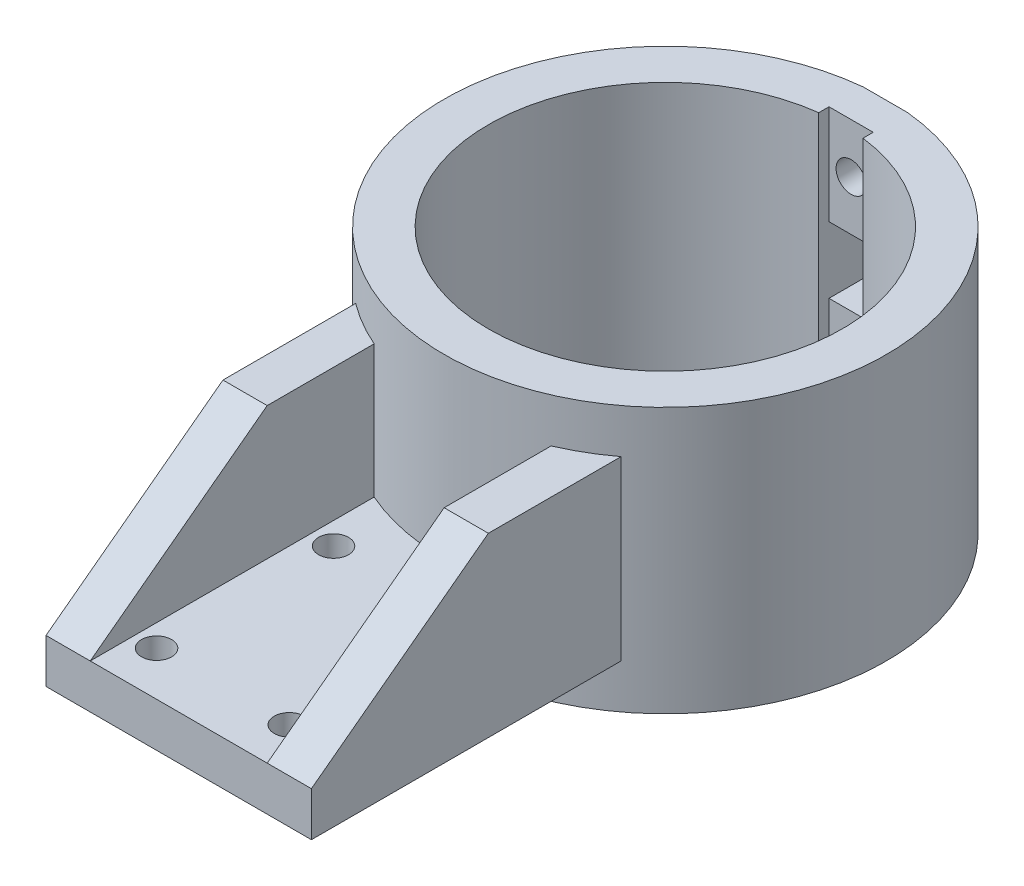
ISO-10303-21;
HEADER;
FILE_DESCRIPTION(('STEP AP214'),'2;1');
FILE_NAME('part.step','',(''),(''),'','','');
FILE_SCHEMA(('AUTOMOTIVE_DESIGN { 1 0 10303 214 1 1 1 1 }'));
ENDSEC;
DATA;
#1=APPLICATION_CONTEXT('core data for automotive mechanical design processes');
#2=APPLICATION_PROTOCOL_DEFINITION('international standard','automotive_design',2000,#1);
#3=PRODUCT_CONTEXT('',#1,'mechanical');
#4=PRODUCT('Part','Part','',(#3));
#5=PRODUCT_RELATED_PRODUCT_CATEGORY('part','',(#4));
#6=PRODUCT_DEFINITION_FORMATION('','',#4);
#7=PRODUCT_DEFINITION_CONTEXT('part definition',#1,'design');
#8=PRODUCT_DEFINITION('design','',#6,#7);
#9=PRODUCT_DEFINITION_SHAPE('','',#8);
#10=(LENGTH_UNIT() NAMED_UNIT(*) SI_UNIT(.MILLI.,.METRE.));
#11=(NAMED_UNIT(*) PLANE_ANGLE_UNIT() SI_UNIT($,.RADIAN.));
#12=(NAMED_UNIT(*) SI_UNIT($,.STERADIAN.) SOLID_ANGLE_UNIT());
#13=UNCERTAINTY_MEASURE_WITH_UNIT(LENGTH_MEASURE(1.E-05),#10,'distance_accuracy_value','');
#14=(GEOMETRIC_REPRESENTATION_CONTEXT(3) GLOBAL_UNCERTAINTY_ASSIGNED_CONTEXT((#13)) GLOBAL_UNIT_ASSIGNED_CONTEXT((#10,
#11,#12)) REPRESENTATION_CONTEXT('',''));
#15=CARTESIAN_POINT('',(0.,0.,0.));
#16=DIRECTION('',(0.,0.,1.));
#17=DIRECTION('',(1.,0.,0.));
#18=AXIS2_PLACEMENT_3D('',#15,#16,#17);
#19=CARTESIAN_POINT('',(-5.,0.,-42.));
#20=DIRECTION('',(0.,0.,-1.));
#21=DIRECTION('',(-1.,0.,0.));
#22=AXIS2_PLACEMENT_3D('',#19,#20,#21);
#23=PLANE('',#22);
#24=CARTESIAN_POINT('',(0.,11.25,-42.));
#25=DIRECTION('',(0.,0.,-1.));
#26=DIRECTION('',(-1.,0.,0.));
#27=AXIS2_PLACEMENT_3D('',#24,#25,#26);
#28=CIRCLE('',#27,3.39999999999999);
#29=CARTESIAN_POINT('',(-3.39999999999999,11.25,-42.));
#30=VERTEX_POINT('',#29);
#31=EDGE_CURVE('E325',#30,#30,#28,.T.);
#32=ORIENTED_EDGE('',*,*,#31,.T.);
#33=EDGE_LOOP('',(#32));
#34=FACE_BOUND('',#33,.T.);
#35=DIRECTION('',(0.,1.,0.));
#36=VECTOR('',#35,1.);
#37=CARTESIAN_POINT('',(5.,0.,-42.));
#38=LINE('',#37,#36);
#39=CARTESIAN_POINT('',(5.,0.,-42.));
#40=VERTEX_POINT('',#39);
#41=CARTESIAN_POINT('',(5.,22.5,-42.));
#42=VERTEX_POINT('',#41);
#43=EDGE_CURVE('E355',#40,#42,#38,.T.);
#44=ORIENTED_EDGE('',*,*,#43,.T.);
#45=DIRECTION('',(1.,0.,0.));
#46=VECTOR('',#45,1.);
#47=CARTESIAN_POINT('',(5.,22.5,-42.));
#48=LINE('',#47,#46);
#49=CARTESIAN_POINT('',(-5.,22.5,-42.));
#50=VERTEX_POINT('',#49);
#51=EDGE_CURVE('E54',#50,#42,#48,.T.);
#52=ORIENTED_EDGE('',*,*,#51,.F.);
#53=DIRECTION('',(0.,1.,0.));
#54=VECTOR('',#53,1.);
#55=CARTESIAN_POINT('',(-5.,0.,-42.));
#56=LINE('',#55,#54);
#57=CARTESIAN_POINT('',(-5.,0.,-42.));
#58=VERTEX_POINT('',#57);
#59=EDGE_CURVE('E215',#58,#50,#56,.T.);
#60=ORIENTED_EDGE('',*,*,#59,.F.);
#61=DIRECTION('',(-1.,0.,0.));
#62=VECTOR('',#61,1.);
#63=CARTESIAN_POINT('',(-5.,0.,-42.));
#64=LINE('',#63,#62);
#65=EDGE_CURVE('E341',#40,#58,#64,.T.);
#66=ORIENTED_EDGE('',*,*,#65,.F.);
#67=EDGE_LOOP('',(#44,#52,#60,#66));
#68=FACE_BOUND('',#67,.T.);
#69=ADVANCED_FACE('F37',(#34,#68),#23,.F.);
#70=CARTESIAN_POINT('',(5.,0.,-49.749371855331));
#71=DIRECTION('',(0.,0.,1.));
#72=DIRECTION('',(1.,0.,0.));
#73=AXIS2_PLACEMENT_3D('',#70,#71,#72);
#74=PLANE('',#73);
#75=CARTESIAN_POINT('',(0.,11.25,-49.749371855331));
#76=DIRECTION('',(0.,0.,-1.));
#77=DIRECTION('',(-1.,0.,0.));
#78=AXIS2_PLACEMENT_3D('',#75,#76,#77);
#79=CIRCLE('',#78,3.39999999999999);
#80=CARTESIAN_POINT('',(-3.4,11.25,-49.749371855331));
#81=VERTEX_POINT('',#80);
#82=EDGE_CURVE('E298',#81,#81,#79,.T.);
#83=ORIENTED_EDGE('',*,*,#82,.F.);
#84=EDGE_LOOP('',(#83));
#85=FACE_BOUND('',#84,.T.);
#86=DIRECTION('',(0.,1.,0.));
#87=VECTOR('',#86,1.);
#88=CARTESIAN_POINT('',(-5.,0.,-49.749371855331));
#89=LINE('',#88,#87);
#90=CARTESIAN_POINT('',(-5.,0.,-49.749371855331));
#91=VERTEX_POINT('',#90);
#92=CARTESIAN_POINT('',(-5.,22.5,-49.749371855331));
#93=VERTEX_POINT('',#92);
#94=EDGE_CURVE('E193',#91,#93,#89,.T.);
#95=ORIENTED_EDGE('',*,*,#94,.T.);
#96=DIRECTION('',(-1.,0.,0.));
#97=VECTOR('',#96,1.);
#98=CARTESIAN_POINT('',(5.,22.5,-49.749371855331));
#99=LINE('',#98,#97);
#100=CARTESIAN_POINT('',(5.,22.5,-49.749371855331));
#101=VERTEX_POINT('',#100);
#102=EDGE_CURVE('E171',#101,#93,#99,.T.);
#103=ORIENTED_EDGE('',*,*,#102,.F.);
#104=DIRECTION('',(0.,1.,0.));
#105=VECTOR('',#104,1.);
#106=CARTESIAN_POINT('',(5.,0.,-49.749371855331));
#107=LINE('',#106,#105);
#108=CARTESIAN_POINT('',(5.,0.,-49.749371855331));
#109=VERTEX_POINT('',#108);
#110=EDGE_CURVE('E190',#109,#101,#107,.T.);
#111=ORIENTED_EDGE('',*,*,#110,.F.);
#112=DIRECTION('',(1.,0.,0.));
#113=VECTOR('',#112,1.);
#114=CARTESIAN_POINT('',(5.,0.,-49.749371855331));
#115=LINE('',#114,#113);
#116=EDGE_CURVE('E356',#91,#109,#115,.T.);
#117=ORIENTED_EDGE('',*,*,#116,.F.);
#118=EDGE_LOOP('',(#95,#103,#111,#117));
#119=FACE_BOUND('',#118,.T.);
#120=ADVANCED_FACE('F189',(#85,#119),#74,.F.);
#121=CARTESIAN_POINT('',(0.,60.,0.));
#122=DIRECTION('',(0.,1.,0.));
#123=DIRECTION('',(0.,0.,1.));
#124=AXIS2_PLACEMENT_3D('',#121,#122,#123);
#125=PLANE('',#124);
#126=DIRECTION('',(0.,0.,-1.));
#127=VECTOR('',#126,1.);
#128=CARTESIAN_POINT('',(5.,60.,-42.));
#129=LINE('',#128,#127);
#130=CARTESIAN_POINT('',(5.,60.,-39.6862696659689));
#131=VERTEX_POINT('',#130);
#132=CARTESIAN_POINT('',(5.,60.,-42.));
#133=VERTEX_POINT('',#132);
#134=EDGE_CURVE('E200',#131,#133,#129,.T.);
#135=ORIENTED_EDGE('',*,*,#134,.F.);
#136=CARTESIAN_POINT('',(0.,60.,0.));
#137=DIRECTION('',(0.,1.,0.));
#138=DIRECTION('',(0.,0.,1.));
#139=AXIS2_PLACEMENT_3D('',#136,#137,#138);
#140=CIRCLE('',#139,40.);
#141=CARTESIAN_POINT('',(-5.,60.,-39.6862696659689));
#142=VERTEX_POINT('',#141);
#143=EDGE_CURVE('E282',#142,#131,#140,.T.);
#144=ORIENTED_EDGE('',*,*,#143,.F.);
#145=DIRECTION('',(0.,0.,1.));
#146=VECTOR('',#145,1.);
#147=CARTESIAN_POINT('',(-5.,60.,-42.));
#148=LINE('',#147,#146);
#149=CARTESIAN_POINT('',(-5.,60.,-42.));
#150=VERTEX_POINT('',#149);
#151=EDGE_CURVE('E342',#150,#142,#148,.T.);
#152=ORIENTED_EDGE('',*,*,#151,.F.);
#153=DIRECTION('',(-1.,0.,0.));
#154=VECTOR('',#153,1.);
#155=CARTESIAN_POINT('',(-5.,60.,-42.));
#156=LINE('',#155,#154);
#157=EDGE_CURVE('E204',#133,#150,#156,.T.);
#158=ORIENTED_EDGE('',*,*,#157,.F.);
#159=EDGE_LOOP('',(#135,#144,#152,#158));
#160=FACE_BOUND('',#159,.T.);
#161=DIRECTION('',(1.,0.,0.));
#162=VECTOR('',#161,1.);
#163=CARTESIAN_POINT('',(5.,60.,-49.749371855331));
#164=LINE('',#163,#162);
#165=CARTESIAN_POINT('',(-5.,60.,-49.749371855331));
#166=VERTEX_POINT('',#165);
#167=CARTESIAN_POINT('',(5.,60.,-49.749371855331));
#168=VERTEX_POINT('',#167);
#169=EDGE_CURVE('E208',#166,#168,#164,.T.);
#170=ORIENTED_EDGE('',*,*,#169,.F.);
#171=CARTESIAN_POINT('',(0.,60.,0.));
#172=DIRECTION('',(0.,1.,0.));
#173=DIRECTION('',(0.,0.,1.));
#174=AXIS2_PLACEMENT_3D('',#171,#172,#173);
#175=CIRCLE('',#174,50.);
#176=EDGE_CURVE('E287',#166,#168,#175,.T.);
#177=ORIENTED_EDGE('',*,*,#176,.T.);
#178=EDGE_LOOP('',(#170,#177));
#179=FACE_BOUND('',#178,.T.);
#180=ADVANCED_FACE('F364',(#160,#179),#125,.T.);
#181=CARTESIAN_POINT('',(0.,0.,0.));
#182=DIRECTION('',(0.,1.,0.));
#183=DIRECTION('',(0.,0.,1.));
#184=AXIS2_PLACEMENT_3D('',#181,#182,#183);
#185=PLANE('',#184);
#186=CARTESIAN_POINT('',(0.,0.,0.));
#187=DIRECTION('',(0.,1.,0.));
#188=DIRECTION('',(0.,0.,1.));
#189=AXIS2_PLACEMENT_3D('',#186,#187,#188);
#190=CIRCLE('',#189,40.);
#191=CARTESIAN_POINT('',(-5.,0.,-39.6862696659689));
#192=VERTEX_POINT('',#191);
#193=CARTESIAN_POINT('',(5.,0.,-39.6862696659689));
#194=VERTEX_POINT('',#193);
#195=EDGE_CURVE('E268',#192,#194,#190,.T.);
#196=ORIENTED_EDGE('',*,*,#195,.T.);
#197=DIRECTION('',(0.,0.,-1.));
#198=VECTOR('',#197,1.);
#199=CARTESIAN_POINT('',(5.,0.,-42.));
#200=LINE('',#199,#198);
#201=EDGE_CURVE('E338',#194,#40,#200,.T.);
#202=ORIENTED_EDGE('',*,*,#201,.T.);
#203=ORIENTED_EDGE('',*,*,#65,.T.);
#204=DIRECTION('',(0.,0.,1.));
#205=VECTOR('',#204,1.);
#206=CARTESIAN_POINT('',(-5.,0.,-42.));
#207=LINE('',#206,#205);
#208=EDGE_CURVE('E345',#58,#192,#207,.T.);
#209=ORIENTED_EDGE('',*,*,#208,.T.);
#210=EDGE_LOOP('',(#196,#202,#203,#209));
#211=FACE_BOUND('',#210,.T.);
#212=CARTESIAN_POINT('',(0.,0.,0.));
#213=DIRECTION('',(0.,1.,0.));
#214=DIRECTION('',(0.,0.,1.));
#215=AXIS2_PLACEMENT_3D('',#212,#213,#214);
#216=CIRCLE('',#215,50.);
#217=EDGE_CURVE('E199',#91,#109,#216,.T.);
#218=ORIENTED_EDGE('',*,*,#217,.F.);
#219=ORIENTED_EDGE('',*,*,#116,.T.);
#220=EDGE_LOOP('',(#218,#219));
#221=FACE_BOUND('',#220,.T.);
#222=ADVANCED_FACE('F378',(#211,#221),#185,.F.);
#223=CARTESIAN_POINT('',(0.,60.,0.));
#224=DIRECTION('',(0.,-1.,0.));
#225=DIRECTION('',(0.,0.,-1.));
#226=AXIS2_PLACEMENT_3D('',#223,#224,#225);
#227=CYLINDRICAL_SURFACE('',#226,50.);
#228=DIRECTION('',(0.,-1.,0.));
#229=VECTOR('',#228,1.);
#230=CARTESIAN_POINT('',(-20.,60.,45.8257569495584));
#231=LINE('',#230,#229);
#232=CARTESIAN_POINT('',(-20.,20.,45.8257569495584));
#233=VERTEX_POINT('',#232);
#234=CARTESIAN_POINT('',(-20.,50.,45.8257569495584));
#235=VERTEX_POINT('',#234);
#236=EDGE_CURVE('E236',#233,#235,#231,.F.);
#237=ORIENTED_EDGE('',*,*,#236,.F.);
#238=CARTESIAN_POINT('',(0.,20.,0.));
#239=DIRECTION('',(0.,1.,0.));
#240=DIRECTION('',(0.,0.,1.));
#241=AXIS2_PLACEMENT_3D('',#238,#239,#240);
#242=CIRCLE('',#241,50.);
#243=CARTESIAN_POINT('',(20.,20.,45.8257569495584));
#244=VERTEX_POINT('',#243);
#245=EDGE_CURVE('E264',#244,#233,#242,.F.);
#246=ORIENTED_EDGE('',*,*,#245,.F.);
#247=DIRECTION('',(0.,-1.,0.));
#248=VECTOR('',#247,1.);
#249=CARTESIAN_POINT('',(20.,60.,45.8257569495584));
#250=LINE('',#249,#248);
#251=CARTESIAN_POINT('',(20.,50.,45.8257569495584));
#252=VERTEX_POINT('',#251);
#253=EDGE_CURVE('E261',#252,#244,#250,.T.);
#254=ORIENTED_EDGE('',*,*,#253,.F.);
#255=CARTESIAN_POINT('',(0.,50.,0.));
#256=DIRECTION('',(0.,1.,0.));
#257=DIRECTION('',(-1.,0.,0.));
#258=AXIS2_PLACEMENT_3D('',#255,#256,#257);
#259=CIRCLE('',#258,50.);
#260=CARTESIAN_POINT('',(30.,50.,40.));
#261=VERTEX_POINT('',#260);
#262=EDGE_CURVE('E260',#261,#252,#259,.F.);
#263=ORIENTED_EDGE('',*,*,#262,.F.);
#264=DIRECTION('',(0.,-1.,0.));
#265=VECTOR('',#264,1.);
#266=CARTESIAN_POINT('',(30.,60.,40.));
#267=LINE('',#266,#265);
#268=CARTESIAN_POINT('',(30.,10.,40.));
#269=VERTEX_POINT('',#268);
#270=EDGE_CURVE('E257',#269,#261,#267,.F.);
#271=ORIENTED_EDGE('',*,*,#270,.F.);
#272=CARTESIAN_POINT('',(0.,10.,0.));
#273=DIRECTION('',(0.,-1.,0.));
#274=DIRECTION('',(1.,0.,0.));
#275=AXIS2_PLACEMENT_3D('',#272,#273,#274);
#276=CIRCLE('',#275,50.);
#277=CARTESIAN_POINT('',(-30.,10.,40.));
#278=VERTEX_POINT('',#277);
#279=EDGE_CURVE('E254',#278,#269,#276,.F.);
#280=ORIENTED_EDGE('',*,*,#279,.F.);
#281=DIRECTION('',(0.,-1.,0.));
#282=VECTOR('',#281,1.);
#283=CARTESIAN_POINT('',(-30.,60.,40.));
#284=LINE('',#283,#282);
#285=CARTESIAN_POINT('',(-30.,50.,40.));
#286=VERTEX_POINT('',#285);
#287=EDGE_CURVE('E235',#286,#278,#284,.T.);
#288=ORIENTED_EDGE('',*,*,#287,.F.);
#289=CARTESIAN_POINT('',(0.,50.,0.));
#290=DIRECTION('',(0.,1.,0.));
#291=DIRECTION('',(0.,0.,1.));
#292=AXIS2_PLACEMENT_3D('',#289,#290,#291);
#293=CIRCLE('',#292,50.);
#294=EDGE_CURVE('E244',#235,#286,#293,.F.);
#295=ORIENTED_EDGE('',*,*,#294,.F.);
#296=EDGE_LOOP('',(#237,#246,#254,#263,#271,#280,#288,#295));
#297=FACE_BOUND('',#296,.T.);
#298=ORIENTED_EDGE('',*,*,#176,.F.);
#299=CARTESIAN_POINT('',(-5.,37.5,-49.749371855331));
#300=VERTEX_POINT('',#299);
#301=EDGE_CURVE('E211',#300,#166,#89,.T.);
#302=ORIENTED_EDGE('',*,*,#301,.F.);
#303=DIRECTION('',(0.,1.,0.));
#304=VECTOR('',#303,1.);
#305=CARTESIAN_POINT('',(-5.,37.5,-49.749371855331));
#306=LINE('',#305,#304);
#307=EDGE_CURVE('E194',#93,#300,#306,.T.);
#308=ORIENTED_EDGE('',*,*,#307,.F.);
#309=ORIENTED_EDGE('',*,*,#94,.F.);
#310=ORIENTED_EDGE('',*,*,#217,.T.);
#311=ORIENTED_EDGE('',*,*,#110,.T.);
#312=DIRECTION('',(0.,-1.,0.));
#313=VECTOR('',#312,1.);
#314=CARTESIAN_POINT('',(5.,37.5,-49.749371855331));
#315=LINE('',#314,#313);
#316=CARTESIAN_POINT('',(5.,37.5,-49.749371855331));
#317=VERTEX_POINT('',#316);
#318=EDGE_CURVE('E178',#317,#101,#315,.T.);
#319=ORIENTED_EDGE('',*,*,#318,.F.);
#320=EDGE_CURVE('E201',#317,#168,#107,.T.);
#321=ORIENTED_EDGE('',*,*,#320,.T.);
#322=EDGE_LOOP('',(#298,#302,#308,#309,#310,#311,#319,#321));
#323=FACE_BOUND('',#322,.T.);
#324=ADVANCED_FACE('F39',(#297,#323),#227,.T.);
#325=CARTESIAN_POINT('',(0.,60.,0.));
#326=DIRECTION('',(0.,-1.,0.));
#327=DIRECTION('',(0.,0.,-1.));
#328=AXIS2_PLACEMENT_3D('',#325,#326,#327);
#329=CYLINDRICAL_SURFACE('',#328,40.);
#330=DIRECTION('',(0.,-1.,0.));
#331=VECTOR('',#330,1.);
#332=CARTESIAN_POINT('',(5.,60.,-39.6862696659689));
#333=LINE('',#332,#331);
#334=EDGE_CURVE('E11',#194,#131,#333,.F.);
#335=ORIENTED_EDGE('',*,*,#334,.F.);
#336=ORIENTED_EDGE('',*,*,#195,.F.);
#337=DIRECTION('',(0.,-1.,0.));
#338=VECTOR('',#337,1.);
#339=CARTESIAN_POINT('',(-5.,60.,-39.6862696659689));
#340=LINE('',#339,#338);
#341=EDGE_CURVE('E46',#142,#192,#340,.T.);
#342=ORIENTED_EDGE('',*,*,#341,.F.);
#343=ORIENTED_EDGE('',*,*,#143,.T.);
#344=EDGE_LOOP('',(#335,#336,#342,#343));
#345=FACE_BOUND('',#344,.T.);
#346=ADVANCED_FACE('F375',(#345),#329,.F.);
#347=CARTESIAN_POINT('',(-20.,20.,-50.002));
#348=DIRECTION('',(0.,1.,0.));
#349=DIRECTION('',(0.,0.,1.));
#350=AXIS2_PLACEMENT_3D('',#347,#348,#349);
#351=PLANE('',#350);
#352=CARTESIAN_POINT('',(-15.,20.,60.));
#353=DIRECTION('',(0.,1.,0.));
#354=DIRECTION('',(0.,0.,1.));
#355=AXIS2_PLACEMENT_3D('',#352,#353,#354);
#356=CIRCLE('',#355,3.39999999999999);
#357=CARTESIAN_POINT('',(-15.,20.,63.4));
#358=VERTEX_POINT('',#357);
#359=EDGE_CURVE('E444',#358,#358,#356,.T.);
#360=ORIENTED_EDGE('',*,*,#359,.F.);
#361=EDGE_LOOP('',(#360));
#362=FACE_BOUND('',#361,.T.);
#363=CARTESIAN_POINT('',(15.,20.,60.));
#364=DIRECTION('',(0.,1.,0.));
#365=DIRECTION('',(0.,0.,1.));
#366=AXIS2_PLACEMENT_3D('',#363,#364,#365);
#367=CIRCLE('',#366,3.39999999999999);
#368=CARTESIAN_POINT('',(15.,20.,63.4));
#369=VERTEX_POINT('',#368);
#370=EDGE_CURVE('E315',#369,#369,#367,.T.);
#371=ORIENTED_EDGE('',*,*,#370,.F.);
#372=EDGE_LOOP('',(#371));
#373=FACE_BOUND('',#372,.T.);
#374=CARTESIAN_POINT('',(-15.,20.,100.));
#375=DIRECTION('',(0.,1.,0.));
#376=DIRECTION('',(0.,0.,1.));
#377=AXIS2_PLACEMENT_3D('',#374,#375,#376);
#378=CIRCLE('',#377,3.39999999999999);
#379=CARTESIAN_POINT('',(-15.,20.,103.4));
#380=VERTEX_POINT('',#379);
#381=EDGE_CURVE('E303',#380,#380,#378,.T.);
#382=ORIENTED_EDGE('',*,*,#381,.F.);
#383=EDGE_LOOP('',(#382));
#384=FACE_BOUND('',#383,.T.);
#385=CARTESIAN_POINT('',(15.,20.,100.));
#386=DIRECTION('',(0.,1.,0.));
#387=DIRECTION('',(0.,0.,1.));
#388=AXIS2_PLACEMENT_3D('',#385,#386,#387);
#389=CIRCLE('',#388,3.39999999999999);
#390=CARTESIAN_POINT('',(15.,20.,103.4));
#391=VERTEX_POINT('',#390);
#392=EDGE_CURVE('E302',#391,#391,#389,.T.);
#393=ORIENTED_EDGE('',*,*,#392,.F.);
#394=EDGE_LOOP('',(#393));
#395=FACE_BOUND('',#394,.T.);
#396=DIRECTION('',(0.,0.,1.));
#397=VECTOR('',#396,1.);
#398=CARTESIAN_POINT('',(20.,20.,-50.002));
#399=LINE('',#398,#397);
#400=CARTESIAN_POINT('',(20.,20.,110.));
#401=VERTEX_POINT('',#400);
#402=EDGE_CURVE('E265',#244,#401,#399,.T.);
#403=ORIENTED_EDGE('',*,*,#402,.F.);
#404=ORIENTED_EDGE('',*,*,#245,.T.);
#405=DIRECTION('',(0.,0.,1.));
#406=VECTOR('',#405,1.);
#407=CARTESIAN_POINT('',(-20.,20.,-50.002));
#408=LINE('',#407,#406);
#409=CARTESIAN_POINT('',(-20.,20.,110.));
#410=VERTEX_POINT('',#409);
#411=EDGE_CURVE('E251',#233,#410,#408,.T.);
#412=ORIENTED_EDGE('',*,*,#411,.T.);
#413=DIRECTION('',(-1.,0.,0.));
#414=VECTOR('',#413,1.);
#415=CARTESIAN_POINT('',(20.,20.,110.));
#416=LINE('',#415,#414);
#417=EDGE_CURVE('E224',#401,#410,#416,.T.);
#418=ORIENTED_EDGE('',*,*,#417,.F.);
#419=EDGE_LOOP('',(#403,#404,#412,#418));
#420=FACE_BOUND('',#419,.T.);
#421=ADVANCED_FACE('F451',(#362,#373,#384,#395,#420),#351,.T.);
#422=CARTESIAN_POINT('',(20.,20.,-50.002));
#423=DIRECTION('',(-1.,0.,0.));
#424=DIRECTION('',(0.,0.,1.));
#425=AXIS2_PLACEMENT_3D('',#422,#423,#424);
#426=PLANE('',#425);
#427=DIRECTION('',(0.,-0.6,0.8));
#428=VECTOR('',#427,1.);
#429=CARTESIAN_POINT('',(20.,96.80096,7.59872000000002));
#430=LINE('',#429,#428);
#431=CARTESIAN_POINT('',(20.,50.,70.));
#432=VERTEX_POINT('',#431);
#433=EDGE_CURVE('E222',#432,#401,#430,.T.);
#434=ORIENTED_EDGE('',*,*,#433,.F.);
#435=DIRECTION('',(0.,0.,1.));
#436=VECTOR('',#435,1.);
#437=CARTESIAN_POINT('',(20.,50.,-50.002));
#438=LINE('',#437,#436);
#439=EDGE_CURVE('E269',#252,#432,#438,.T.);
#440=ORIENTED_EDGE('',*,*,#439,.F.);
#441=ORIENTED_EDGE('',*,*,#253,.T.);
#442=ORIENTED_EDGE('',*,*,#402,.T.);
#443=EDGE_LOOP('',(#434,#440,#441,#442));
#444=FACE_BOUND('',#443,.T.);
#445=ADVANCED_FACE('F454',(#444),#426,.T.);
#446=CARTESIAN_POINT('',(20.,50.,-50.002));
#447=DIRECTION('',(0.,1.,0.));
#448=DIRECTION('',(-1.,0.,0.));
#449=AXIS2_PLACEMENT_3D('',#446,#447,#448);
#450=PLANE('',#449);
#451=DIRECTION('',(-1.,0.,0.));
#452=VECTOR('',#451,1.);
#453=CARTESIAN_POINT('',(50.,50.,70.));
#454=LINE('',#453,#452);
#455=CARTESIAN_POINT('',(30.,50.,70.));
#456=VERTEX_POINT('',#455);
#457=EDGE_CURVE('E214',#456,#432,#454,.T.);
#458=ORIENTED_EDGE('',*,*,#457,.F.);
#459=DIRECTION('',(0.,0.,1.));
#460=VECTOR('',#459,1.);
#461=CARTESIAN_POINT('',(30.,50.,-50.002));
#462=LINE('',#461,#460);
#463=EDGE_CURVE('E272',#261,#456,#462,.T.);
#464=ORIENTED_EDGE('',*,*,#463,.F.);
#465=ORIENTED_EDGE('',*,*,#262,.T.);
#466=ORIENTED_EDGE('',*,*,#439,.T.);
#467=EDGE_LOOP('',(#458,#464,#465,#466));
#468=FACE_BOUND('',#467,.T.);
#469=ADVANCED_FACE('F470',(#468),#450,.T.);
#470=CARTESIAN_POINT('',(30.,10.,-50.002));
#471=DIRECTION('',(1.,0.,0.));
#472=DIRECTION('',(0.,0.,-1.));
#473=AXIS2_PLACEMENT_3D('',#470,#471,#472);
#474=PLANE('',#473);
#475=DIRECTION('',(0.,0.6,-0.8));
#476=VECTOR('',#475,1.);
#477=CARTESIAN_POINT('',(30.,93.20096,12.39872));
#478=LINE('',#477,#476);
#479=CARTESIAN_POINT('',(30.,20.,110.));
#480=VERTEX_POINT('',#479);
#481=EDGE_CURVE('E220',#480,#456,#478,.T.);
#482=ORIENTED_EDGE('',*,*,#481,.F.);
#483=DIRECTION('',(0.,1.,0.));
#484=VECTOR('',#483,1.);
#485=CARTESIAN_POINT('',(30.,10.,110.));
#486=LINE('',#485,#484);
#487=CARTESIAN_POINT('',(30.,10.,110.));
#488=VERTEX_POINT('',#487);
#489=EDGE_CURVE('E232',#488,#480,#486,.T.);
#490=ORIENTED_EDGE('',*,*,#489,.F.);
#491=DIRECTION('',(0.,0.,1.));
#492=VECTOR('',#491,1.);
#493=CARTESIAN_POINT('',(30.,10.,-50.002));
#494=LINE('',#493,#492);
#495=EDGE_CURVE('E275',#269,#488,#494,.T.);
#496=ORIENTED_EDGE('',*,*,#495,.F.);
#497=ORIENTED_EDGE('',*,*,#270,.T.);
#498=ORIENTED_EDGE('',*,*,#463,.T.);
#499=EDGE_LOOP('',(#482,#490,#496,#497,#498));
#500=FACE_BOUND('',#499,.T.);
#501=ADVANCED_FACE('F473',(#500),#474,.T.);
#502=CARTESIAN_POINT('',(30.,10.,-50.002));
#503=DIRECTION('',(0.,-1.,0.));
#504=DIRECTION('',(1.,0.,0.));
#505=AXIS2_PLACEMENT_3D('',#502,#503,#504);
#506=PLANE('',#505);
#507=CARTESIAN_POINT('',(-15.,10.,60.));
#508=DIRECTION('',(0.,-1.,0.));
#509=DIRECTION('',(1.,0.,0.));
#510=AXIS2_PLACEMENT_3D('',#507,#508,#509);
#511=CIRCLE('',#510,3.39999999999999);
#512=CARTESIAN_POINT('',(-11.6,10.,60.));
#513=VERTEX_POINT('',#512);
#514=EDGE_CURVE('E41',#513,#513,#511,.T.);
#515=ORIENTED_EDGE('',*,*,#514,.F.);
#516=EDGE_LOOP('',(#515));
#517=FACE_BOUND('',#516,.T.);
#518=CARTESIAN_POINT('',(15.,10.,60.));
#519=DIRECTION('',(0.,-1.,0.));
#520=DIRECTION('',(1.,0.,0.));
#521=AXIS2_PLACEMENT_3D('',#518,#519,#520);
#522=CIRCLE('',#521,3.39999999999999);
#523=CARTESIAN_POINT('',(18.4,10.,60.));
#524=VERTEX_POINT('',#523);
#525=EDGE_CURVE('E310',#524,#524,#522,.T.);
#526=ORIENTED_EDGE('',*,*,#525,.F.);
#527=EDGE_LOOP('',(#526));
#528=FACE_BOUND('',#527,.T.);
#529=CARTESIAN_POINT('',(-15.,10.,100.));
#530=DIRECTION('',(0.,-1.,0.));
#531=DIRECTION('',(1.,0.,0.));
#532=AXIS2_PLACEMENT_3D('',#529,#530,#531);
#533=CIRCLE('',#532,3.39999999999999);
#534=CARTESIAN_POINT('',(-11.6,10.,100.));
#535=VERTEX_POINT('',#534);
#536=EDGE_CURVE('E300',#535,#535,#533,.T.);
#537=ORIENTED_EDGE('',*,*,#536,.F.);
#538=EDGE_LOOP('',(#537));
#539=FACE_BOUND('',#538,.T.);
#540=CARTESIAN_POINT('',(15.,10.,100.));
#541=DIRECTION('',(0.,-1.,0.));
#542=DIRECTION('',(1.,0.,0.));
#543=AXIS2_PLACEMENT_3D('',#540,#541,#542);
#544=CIRCLE('',#543,3.39999999999999);
#545=CARTESIAN_POINT('',(18.4,10.,100.));
#546=VERTEX_POINT('',#545);
#547=EDGE_CURVE('E307',#546,#546,#544,.T.);
#548=ORIENTED_EDGE('',*,*,#547,.F.);
#549=EDGE_LOOP('',(#548));
#550=FACE_BOUND('',#549,.T.);
#551=ORIENTED_EDGE('',*,*,#495,.T.);
#552=DIRECTION('',(1.,0.,0.));
#553=VECTOR('',#552,1.);
#554=CARTESIAN_POINT('',(-30.,9.99999999999999,110.));
#555=LINE('',#554,#553);
#556=CARTESIAN_POINT('',(-30.,9.99999999999999,110.));
#557=VERTEX_POINT('',#556);
#558=EDGE_CURVE('E229',#557,#488,#555,.T.);
#559=ORIENTED_EDGE('',*,*,#558,.F.);
#560=DIRECTION('',(0.,0.,1.));
#561=VECTOR('',#560,1.);
#562=CARTESIAN_POINT('',(-30.,9.99999999999999,-50.002));
#563=LINE('',#562,#561);
#564=EDGE_CURVE('E243',#278,#557,#563,.T.);
#565=ORIENTED_EDGE('',*,*,#564,.F.);
#566=ORIENTED_EDGE('',*,*,#279,.T.);
#567=EDGE_LOOP('',(#551,#559,#565,#566));
#568=FACE_BOUND('',#567,.T.);
#569=ADVANCED_FACE('F478',(#517,#528,#539,#550,#568),#506,.T.);
#570=CARTESIAN_POINT('',(-30.,9.99999999999999,-50.002));
#571=DIRECTION('',(-1.,0.,0.));
#572=DIRECTION('',(0.,0.,1.));
#573=AXIS2_PLACEMENT_3D('',#570,#571,#572);
#574=PLANE('',#573);
#575=DIRECTION('',(0.,-0.6,0.8));
#576=VECTOR('',#575,1.);
#577=CARTESIAN_POINT('',(-30.,93.20096,12.39872));
#578=LINE('',#577,#576);
#579=CARTESIAN_POINT('',(-30.,50.,70.));
#580=VERTEX_POINT('',#579);
#581=CARTESIAN_POINT('',(-30.,20.,110.));
#582=VERTEX_POINT('',#581);
#583=EDGE_CURVE('E218',#580,#582,#578,.T.);
#584=ORIENTED_EDGE('',*,*,#583,.F.);
#585=DIRECTION('',(0.,0.,1.));
#586=VECTOR('',#585,1.);
#587=CARTESIAN_POINT('',(-30.,50.,-50.002));
#588=LINE('',#587,#586);
#589=EDGE_CURVE('E240',#286,#580,#588,.T.);
#590=ORIENTED_EDGE('',*,*,#589,.F.);
#591=ORIENTED_EDGE('',*,*,#287,.T.);
#592=ORIENTED_EDGE('',*,*,#564,.T.);
#593=DIRECTION('',(0.,-1.,0.));
#594=VECTOR('',#593,1.);
#595=CARTESIAN_POINT('',(-30.,50.,110.));
#596=LINE('',#595,#594);
#597=EDGE_CURVE('E227',#582,#557,#596,.T.);
#598=ORIENTED_EDGE('',*,*,#597,.F.);
#599=EDGE_LOOP('',(#584,#590,#591,#592,#598));
#600=FACE_BOUND('',#599,.T.);
#601=ADVANCED_FACE('F483',(#600),#574,.T.);
#602=CARTESIAN_POINT('',(-30.,50.,-50.002));
#603=DIRECTION('',(0.,1.,0.));
#604=DIRECTION('',(0.,0.,1.));
#605=AXIS2_PLACEMENT_3D('',#602,#603,#604);
#606=PLANE('',#605);
#607=CARTESIAN_POINT('',(-20.,50.,70.));
#608=VERTEX_POINT('',#607);
#609=EDGE_CURVE('E212',#608,#580,#454,.T.);
#610=ORIENTED_EDGE('',*,*,#609,.F.);
#611=DIRECTION('',(0.,0.,1.));
#612=VECTOR('',#611,1.);
#613=CARTESIAN_POINT('',(-20.,50.,-50.002));
#614=LINE('',#613,#612);
#615=EDGE_CURVE('E239',#235,#608,#614,.T.);
#616=ORIENTED_EDGE('',*,*,#615,.F.);
#617=ORIENTED_EDGE('',*,*,#294,.T.);
#618=ORIENTED_EDGE('',*,*,#589,.T.);
#619=EDGE_LOOP('',(#610,#616,#617,#618));
#620=FACE_BOUND('',#619,.T.);
#621=ADVANCED_FACE('F488',(#620),#606,.T.);
#622=CARTESIAN_POINT('',(-20.,50.,-50.002));
#623=DIRECTION('',(1.,0.,0.));
#624=DIRECTION('',(0.,1.,0.));
#625=AXIS2_PLACEMENT_3D('',#622,#623,#624);
#626=PLANE('',#625);
#627=DIRECTION('',(0.,0.6,-0.8));
#628=VECTOR('',#627,1.);
#629=CARTESIAN_POINT('',(-20.,107.60096,-6.80127999999998));
#630=LINE('',#629,#628);
#631=EDGE_CURVE('E216',#410,#608,#630,.T.);
#632=ORIENTED_EDGE('',*,*,#631,.F.);
#633=ORIENTED_EDGE('',*,*,#411,.F.);
#634=ORIENTED_EDGE('',*,*,#236,.T.);
#635=ORIENTED_EDGE('',*,*,#615,.T.);
#636=EDGE_LOOP('',(#632,#633,#634,#635));
#637=FACE_BOUND('',#636,.T.);
#638=ADVANCED_FACE('F456',(#637),#626,.T.);
#639=CARTESIAN_POINT('',(0.,0.,110.));
#640=DIRECTION('',(0.,0.,-1.));
#641=DIRECTION('',(-1.,0.,0.));
#642=AXIS2_PLACEMENT_3D('',#639,#640,#641);
#643=PLANE('',#642);
#644=ORIENTED_EDGE('',*,*,#489,.T.);
#645=DIRECTION('',(-1.,0.,0.));
#646=VECTOR('',#645,1.);
#647=CARTESIAN_POINT('',(0.,20.,110.));
#648=LINE('',#647,#646);
#649=EDGE_CURVE('E294',#480,#401,#648,.T.);
#650=ORIENTED_EDGE('',*,*,#649,.T.);
#651=ORIENTED_EDGE('',*,*,#417,.T.);
#652=EDGE_CURVE('E290',#410,#582,#648,.T.);
#653=ORIENTED_EDGE('',*,*,#652,.T.);
#654=ORIENTED_EDGE('',*,*,#597,.T.);
#655=ORIENTED_EDGE('',*,*,#558,.T.);
#656=EDGE_LOOP('',(#644,#650,#651,#653,#654,#655));
#657=FACE_BOUND('',#656,.T.);
#658=ADVANCED_FACE('F494',(#657),#643,.F.);
#659=CARTESIAN_POINT('',(50.,20.,110.));
#660=DIRECTION('',(0.,-0.8,-0.6));
#661=DIRECTION('',(0.,0.6,-0.8));
#662=AXIS2_PLACEMENT_3D('',#659,#660,#661);
#663=PLANE('',#662);
#664=ORIENTED_EDGE('',*,*,#583,.T.);
#665=ORIENTED_EDGE('',*,*,#652,.F.);
#666=ORIENTED_EDGE('',*,*,#631,.T.);
#667=ORIENTED_EDGE('',*,*,#609,.T.);
#668=EDGE_LOOP('',(#664,#665,#666,#667));
#669=FACE_BOUND('',#668,.T.);
#670=ADVANCED_FACE('F498',(#669),#663,.F.);
#671=ORIENTED_EDGE('',*,*,#433,.T.);
#672=ORIENTED_EDGE('',*,*,#649,.F.);
#673=ORIENTED_EDGE('',*,*,#481,.T.);
#674=ORIENTED_EDGE('',*,*,#457,.T.);
#675=EDGE_LOOP('',(#671,#672,#673,#674));
#676=FACE_BOUND('',#675,.T.);
#677=ADVANCED_FACE('F496',(#676),#663,.F.);
#678=CARTESIAN_POINT('',(5.,0.,-42.));
#679=DIRECTION('',(1.,0.,0.));
#680=DIRECTION('',(0.,0.,-1.));
#681=AXIS2_PLACEMENT_3D('',#678,#679,#680);
#682=PLANE('',#681);
#683=ORIENTED_EDGE('',*,*,#334,.T.);
#684=ORIENTED_EDGE('',*,*,#134,.T.);
#685=CARTESIAN_POINT('',(5.,37.5,-42.));
#686=VERTEX_POINT('',#685);
#687=EDGE_CURVE('E347',#686,#133,#38,.T.);
#688=ORIENTED_EDGE('',*,*,#687,.F.);
#689=DIRECTION('',(0.,0.,-1.));
#690=VECTOR('',#689,1.);
#691=CARTESIAN_POINT('',(5.,37.5,110.001));
#692=LINE('',#691,#690);
#693=EDGE_CURVE('E181',#686,#317,#692,.T.);
#694=ORIENTED_EDGE('',*,*,#693,.T.);
#695=ORIENTED_EDGE('',*,*,#318,.T.);
#696=DIRECTION('',(0.,0.,-1.));
#697=VECTOR('',#696,1.);
#698=CARTESIAN_POINT('',(5.,22.5,110.001));
#699=LINE('',#698,#697);
#700=EDGE_CURVE('E167',#42,#101,#699,.T.);
#701=ORIENTED_EDGE('',*,*,#700,.F.);
#702=ORIENTED_EDGE('',*,*,#43,.F.);
#703=ORIENTED_EDGE('',*,*,#201,.F.);
#704=EDGE_LOOP('',(#683,#684,#688,#694,#695,#701,#702,#703));
#705=FACE_BOUND('',#704,.T.);
#706=ADVANCED_FACE('F179',(#705),#682,.F.);
#707=CARTESIAN_POINT('',(-5.,0.,-42.));
#708=DIRECTION('',(-1.,0.,0.));
#709=DIRECTION('',(0.,0.,1.));
#710=AXIS2_PLACEMENT_3D('',#707,#708,#709);
#711=PLANE('',#710);
#712=ORIENTED_EDGE('',*,*,#341,.T.);
#713=ORIENTED_EDGE('',*,*,#208,.F.);
#714=ORIENTED_EDGE('',*,*,#59,.T.);
#715=DIRECTION('',(0.,0.,-1.));
#716=VECTOR('',#715,1.);
#717=CARTESIAN_POINT('',(-5.,22.5,110.001));
#718=LINE('',#717,#716);
#719=EDGE_CURVE('E175',#50,#93,#718,.T.);
#720=ORIENTED_EDGE('',*,*,#719,.T.);
#721=ORIENTED_EDGE('',*,*,#307,.T.);
#722=DIRECTION('',(0.,0.,-1.));
#723=VECTOR('',#722,1.);
#724=CARTESIAN_POINT('',(-5.,37.5,110.001));
#725=LINE('',#724,#723);
#726=CARTESIAN_POINT('',(-5.,37.5,-42.));
#727=VERTEX_POINT('',#726);
#728=EDGE_CURVE('E334',#727,#300,#725,.T.);
#729=ORIENTED_EDGE('',*,*,#728,.F.);
#730=EDGE_CURVE('E354',#727,#150,#56,.T.);
#731=ORIENTED_EDGE('',*,*,#730,.T.);
#732=ORIENTED_EDGE('',*,*,#151,.T.);
#733=EDGE_LOOP('',(#712,#713,#714,#720,#721,#729,#731,#732));
#734=FACE_BOUND('',#733,.T.);
#735=ADVANCED_FACE('F366',(#734),#711,.F.);
#736=CARTESIAN_POINT('',(0.,48.75,-42.));
#737=DIRECTION('',(0.,0.,-1.));
#738=DIRECTION('',(-1.,0.,0.));
#739=AXIS2_PLACEMENT_3D('',#736,#737,#738);
#740=CIRCLE('',#739,3.39999999999999);
#741=CARTESIAN_POINT('',(-3.39999999999999,48.75,-42.));
#742=VERTEX_POINT('',#741);
#743=EDGE_CURVE('E296',#742,#742,#740,.T.);
#744=ORIENTED_EDGE('',*,*,#743,.T.);
#745=EDGE_LOOP('',(#744));
#746=FACE_BOUND('',#745,.T.);
#747=ORIENTED_EDGE('',*,*,#730,.F.);
#748=DIRECTION('',(-1.,0.,0.));
#749=VECTOR('',#748,1.);
#750=CARTESIAN_POINT('',(5.,37.5,-42.));
#751=LINE('',#750,#749);
#752=EDGE_CURVE('E185',#686,#727,#751,.T.);
#753=ORIENTED_EDGE('',*,*,#752,.F.);
#754=ORIENTED_EDGE('',*,*,#687,.T.);
#755=ORIENTED_EDGE('',*,*,#157,.T.);
#756=EDGE_LOOP('',(#747,#753,#754,#755));
#757=FACE_BOUND('',#756,.T.);
#758=ADVANCED_FACE('F385',(#746,#757),#23,.F.);
#759=CARTESIAN_POINT('',(0.,48.75,-49.749371855331));
#760=DIRECTION('',(0.,0.,-1.));
#761=DIRECTION('',(-1.,0.,0.));
#762=AXIS2_PLACEMENT_3D('',#759,#760,#761);
#763=CIRCLE('',#762,3.39999999999999);
#764=CARTESIAN_POINT('',(-3.39999999999999,48.75,-49.749371855331));
#765=VERTEX_POINT('',#764);
#766=EDGE_CURVE('E299',#765,#765,#763,.T.);
#767=ORIENTED_EDGE('',*,*,#766,.F.);
#768=EDGE_LOOP('',(#767));
#769=FACE_BOUND('',#768,.T.);
#770=ORIENTED_EDGE('',*,*,#320,.F.);
#771=DIRECTION('',(1.,0.,0.));
#772=VECTOR('',#771,1.);
#773=CARTESIAN_POINT('',(5.,37.5,-49.749371855331));
#774=LINE('',#773,#772);
#775=EDGE_CURVE('E62',#300,#317,#774,.T.);
#776=ORIENTED_EDGE('',*,*,#775,.F.);
#777=ORIENTED_EDGE('',*,*,#301,.T.);
#778=ORIENTED_EDGE('',*,*,#169,.T.);
#779=EDGE_LOOP('',(#770,#776,#777,#778));
#780=FACE_BOUND('',#779,.T.);
#781=ADVANCED_FACE('F361',(#769,#780),#74,.F.);
#782=CARTESIAN_POINT('',(5.,22.5,110.001));
#783=DIRECTION('',(0.,-1.,0.));
#784=DIRECTION('',(0.,0.,-1.));
#785=AXIS2_PLACEMENT_3D('',#782,#783,#784);
#786=PLANE('',#785);
#787=ORIENTED_EDGE('',*,*,#51,.T.);
#788=ORIENTED_EDGE('',*,*,#700,.T.);
#789=ORIENTED_EDGE('',*,*,#102,.T.);
#790=ORIENTED_EDGE('',*,*,#719,.F.);
#791=EDGE_LOOP('',(#787,#788,#789,#790));
#792=FACE_BOUND('',#791,.T.);
#793=ADVANCED_FACE('F169',(#792),#786,.F.);
#794=CARTESIAN_POINT('',(5.,37.5,110.001));
#795=DIRECTION('',(0.,1.,0.));
#796=DIRECTION('',(0.,0.,1.));
#797=AXIS2_PLACEMENT_3D('',#794,#795,#796);
#798=PLANE('',#797);
#799=ORIENTED_EDGE('',*,*,#752,.T.);
#800=ORIENTED_EDGE('',*,*,#728,.T.);
#801=ORIENTED_EDGE('',*,*,#775,.T.);
#802=ORIENTED_EDGE('',*,*,#693,.F.);
#803=EDGE_LOOP('',(#799,#800,#801,#802));
#804=FACE_BOUND('',#803,.T.);
#805=ADVANCED_FACE('F386',(#804),#798,.F.);
#806=CARTESIAN_POINT('',(0.,11.25,-49.749371855331));
#807=DIRECTION('',(0.,0.,-1.));
#808=DIRECTION('',(-1.,0.,0.));
#809=AXIS2_PLACEMENT_3D('',#806,#807,#808);
#810=CYLINDRICAL_SURFACE('',#809,3.39999999999999);
#811=ORIENTED_EDGE('',*,*,#82,.T.);
#812=EDGE_LOOP('',(#811));
#813=FACE_BOUND('',#812,.T.);
#814=ORIENTED_EDGE('',*,*,#31,.F.);
#815=EDGE_LOOP('',(#814));
#816=FACE_BOUND('',#815,.T.);
#817=ADVANCED_FACE('F388',(#813,#816),#810,.F.);
#818=CARTESIAN_POINT('',(0.,48.75,-49.749371855331));
#819=DIRECTION('',(0.,0.,-1.));
#820=DIRECTION('',(-1.,0.,0.));
#821=AXIS2_PLACEMENT_3D('',#818,#819,#820);
#822=CYLINDRICAL_SURFACE('',#821,3.39999999999999);
#823=ORIENTED_EDGE('',*,*,#766,.T.);
#824=EDGE_LOOP('',(#823));
#825=FACE_BOUND('',#824,.T.);
#826=ORIENTED_EDGE('',*,*,#743,.F.);
#827=EDGE_LOOP('',(#826));
#828=FACE_BOUND('',#827,.T.);
#829=ADVANCED_FACE('F394',(#825,#828),#822,.F.);
#830=CARTESIAN_POINT('',(15.,20.,100.));
#831=DIRECTION('',(0.,1.,0.));
#832=DIRECTION('',(0.,0.,1.));
#833=AXIS2_PLACEMENT_3D('',#830,#831,#832);
#834=CYLINDRICAL_SURFACE('',#833,3.39999999999999);
#835=ORIENTED_EDGE('',*,*,#547,.T.);
#836=EDGE_LOOP('',(#835));
#837=FACE_BOUND('',#836,.T.);
#838=ORIENTED_EDGE('',*,*,#392,.T.);
#839=EDGE_LOOP('',(#838));
#840=FACE_BOUND('',#839,.T.);
#841=ADVANCED_FACE('F418',(#837,#840),#834,.F.);
#842=CARTESIAN_POINT('',(-15.,20.,100.));
#843=DIRECTION('',(0.,1.,0.));
#844=DIRECTION('',(0.,0.,1.));
#845=AXIS2_PLACEMENT_3D('',#842,#843,#844);
#846=CYLINDRICAL_SURFACE('',#845,3.39999999999999);
#847=ORIENTED_EDGE('',*,*,#536,.T.);
#848=EDGE_LOOP('',(#847));
#849=FACE_BOUND('',#848,.T.);
#850=ORIENTED_EDGE('',*,*,#381,.T.);
#851=EDGE_LOOP('',(#850));
#852=FACE_BOUND('',#851,.T.);
#853=ADVANCED_FACE('F424',(#849,#852),#846,.F.);
#854=CARTESIAN_POINT('',(15.,20.,60.));
#855=DIRECTION('',(0.,1.,0.));
#856=DIRECTION('',(0.,0.,1.));
#857=AXIS2_PLACEMENT_3D('',#854,#855,#856);
#858=CYLINDRICAL_SURFACE('',#857,3.39999999999999);
#859=ORIENTED_EDGE('',*,*,#525,.T.);
#860=EDGE_LOOP('',(#859));
#861=FACE_BOUND('',#860,.T.);
#862=ORIENTED_EDGE('',*,*,#370,.T.);
#863=EDGE_LOOP('',(#862));
#864=FACE_BOUND('',#863,.T.);
#865=ADVANCED_FACE('F430',(#861,#864),#858,.F.);
#866=CARTESIAN_POINT('',(-15.,20.,60.));
#867=DIRECTION('',(0.,1.,0.));
#868=DIRECTION('',(0.,0.,1.));
#869=AXIS2_PLACEMENT_3D('',#866,#867,#868);
#870=CYLINDRICAL_SURFACE('',#869,3.39999999999999);
#871=ORIENTED_EDGE('',*,*,#514,.T.);
#872=EDGE_LOOP('',(#871));
#873=FACE_BOUND('',#872,.T.);
#874=ORIENTED_EDGE('',*,*,#359,.T.);
#875=EDGE_LOOP('',(#874));
#876=FACE_BOUND('',#875,.T.);
#877=ADVANCED_FACE('F433',(#873,#876),#870,.F.);
#878=CLOSED_SHELL('',(#69,#120,#180,#222,#324,#346,#421,#445,#469,#501,#569,#601,#621,#638,#658,
#670,#677,#706,#735,#758,#781,#793,#805,#817,#829,#841,#853,#865,#877));
#879=MANIFOLD_SOLID_BREP('B2',#878);
#880=ADVANCED_BREP_SHAPE_REPRESENTATION('',(#18,#879),#14);
#881=SHAPE_DEFINITION_REPRESENTATION(#9,#880);
ENDSEC;
END-ISO-10303-21;
